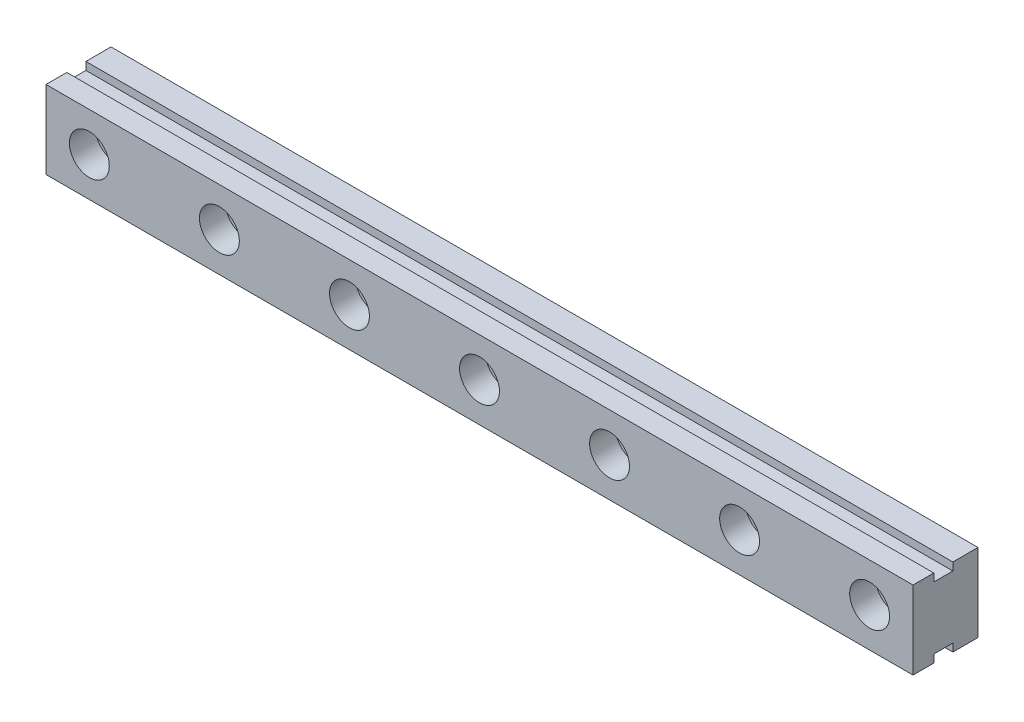
ISO-10303-21;
HEADER;
FILE_DESCRIPTION(('STEP AP214'),'2;1');
FILE_NAME('part.step','',(''),(''),'','','');
FILE_SCHEMA(('AUTOMOTIVE_DESIGN { 1 0 10303 214 1 1 1 1 }'));
ENDSEC;
DATA;
#1=APPLICATION_CONTEXT('core data for automotive mechanical design processes');
#2=APPLICATION_PROTOCOL_DEFINITION('international standard','automotive_design',2000,#1);
#3=PRODUCT_CONTEXT('',#1,'mechanical');
#4=PRODUCT('Part','Part','',(#3));
#5=PRODUCT_RELATED_PRODUCT_CATEGORY('part','',(#4));
#6=PRODUCT_DEFINITION_FORMATION('','',#4);
#7=PRODUCT_DEFINITION_CONTEXT('part definition',#1,'design');
#8=PRODUCT_DEFINITION('design','',#6,#7);
#9=PRODUCT_DEFINITION_SHAPE('','',#8);
#10=(LENGTH_UNIT() NAMED_UNIT(*) SI_UNIT(.MILLI.,.METRE.));
#11=(NAMED_UNIT(*) PLANE_ANGLE_UNIT() SI_UNIT($,.RADIAN.));
#12=(NAMED_UNIT(*) SI_UNIT($,.STERADIAN.) SOLID_ANGLE_UNIT());
#13=UNCERTAINTY_MEASURE_WITH_UNIT(LENGTH_MEASURE(1.E-05),#10,'distance_accuracy_value','');
#14=(GEOMETRIC_REPRESENTATION_CONTEXT(3) GLOBAL_UNCERTAINTY_ASSIGNED_CONTEXT((#13)) GLOBAL_UNIT_ASSIGNED_CONTEXT((#10,
#11,#12)) REPRESENTATION_CONTEXT('',''));
#15=CARTESIAN_POINT('',(0.,0.,0.));
#16=DIRECTION('',(0.,0.,1.));
#17=DIRECTION('',(1.,0.,0.));
#18=AXIS2_PLACEMENT_3D('',#15,#16,#17);
#19=CARTESIAN_POINT('',(78.,18.5,35.2));
#20=DIRECTION('',(0.,0.,-1.));
#21=DIRECTION('',(-1.,0.,0.));
#22=AXIS2_PLACEMENT_3D('',#19,#20,#21);
#23=CYLINDRICAL_SURFACE('',#22,1.35);
#24=CARTESIAN_POINT('',(78.,18.5,27.5));
#25=DIRECTION('',(0.,0.,1.));
#26=DIRECTION('',(1.,0.,0.));
#27=AXIS2_PLACEMENT_3D('',#24,#25,#26);
#28=CIRCLE('',#27,1.35);
#29=CARTESIAN_POINT('',(79.35,18.5,27.5));
#30=VERTEX_POINT('',#29);
#31=EDGE_CURVE('E241',#30,#30,#28,.F.);
#32=ORIENTED_EDGE('',*,*,#31,.T.);
#33=EDGE_LOOP('',(#32));
#34=FACE_BOUND('',#33,.T.);
#35=CARTESIAN_POINT('',(78.,18.5,32.));
#36=DIRECTION('',(0.,0.,1.));
#37=DIRECTION('',(1.,0.,0.));
#38=AXIS2_PLACEMENT_3D('',#35,#36,#37);
#39=CIRCLE('',#38,1.35);
#40=CARTESIAN_POINT('',(79.35,18.5,32.));
#41=VERTEX_POINT('',#40);
#42=EDGE_CURVE('E297',#41,#41,#39,.T.);
#43=ORIENTED_EDGE('',*,*,#42,.T.);
#44=EDGE_LOOP('',(#43));
#45=FACE_BOUND('',#44,.T.);
#46=ADVANCED_FACE('F44',(#34,#45),#23,.F.);
#47=CARTESIAN_POINT('',(63.,18.5,35.2));
#48=DIRECTION('',(0.,0.,-1.));
#49=DIRECTION('',(-1.,0.,0.));
#50=AXIS2_PLACEMENT_3D('',#47,#48,#49);
#51=CYLINDRICAL_SURFACE('',#50,1.35);
#52=CARTESIAN_POINT('',(63.,18.5,27.5));
#53=DIRECTION('',(0.,0.,1.));
#54=DIRECTION('',(1.,0.,0.));
#55=AXIS2_PLACEMENT_3D('',#52,#53,#54);
#56=CIRCLE('',#55,1.35);
#57=CARTESIAN_POINT('',(64.35,18.5,27.5));
#58=VERTEX_POINT('',#57);
#59=EDGE_CURVE('E249',#58,#58,#56,.F.);
#60=ORIENTED_EDGE('',*,*,#59,.T.);
#61=EDGE_LOOP('',(#60));
#62=FACE_BOUND('',#61,.T.);
#63=CARTESIAN_POINT('',(63.,18.5,32.));
#64=DIRECTION('',(0.,0.,1.));
#65=DIRECTION('',(1.,0.,0.));
#66=AXIS2_PLACEMENT_3D('',#63,#64,#65);
#67=CIRCLE('',#66,1.35);
#68=CARTESIAN_POINT('',(64.35,18.5,32.));
#69=VERTEX_POINT('',#68);
#70=EDGE_CURVE('E294',#69,#69,#67,.T.);
#71=ORIENTED_EDGE('',*,*,#70,.T.);
#72=EDGE_LOOP('',(#71));
#73=FACE_BOUND('',#72,.T.);
#74=ADVANCED_FACE('F434',(#62,#73),#51,.F.);
#75=CARTESIAN_POINT('',(48.,18.5,35.2));
#76=DIRECTION('',(0.,0.,-1.));
#77=DIRECTION('',(-1.,0.,0.));
#78=AXIS2_PLACEMENT_3D('',#75,#76,#77);
#79=CYLINDRICAL_SURFACE('',#78,1.35);
#80=CARTESIAN_POINT('',(48.,18.5,27.5));
#81=DIRECTION('',(0.,0.,1.));
#82=DIRECTION('',(1.,0.,0.));
#83=AXIS2_PLACEMENT_3D('',#80,#81,#82);
#84=CIRCLE('',#83,1.35);
#85=CARTESIAN_POINT('',(49.35,18.5,27.5));
#86=VERTEX_POINT('',#85);
#87=EDGE_CURVE('E251',#86,#86,#84,.F.);
#88=ORIENTED_EDGE('',*,*,#87,.T.);
#89=EDGE_LOOP('',(#88));
#90=FACE_BOUND('',#89,.T.);
#91=CARTESIAN_POINT('',(48.,18.5,32.));
#92=DIRECTION('',(0.,0.,1.));
#93=DIRECTION('',(1.,0.,0.));
#94=AXIS2_PLACEMENT_3D('',#91,#92,#93);
#95=CIRCLE('',#94,1.35);
#96=CARTESIAN_POINT('',(49.35,18.5,32.));
#97=VERTEX_POINT('',#96);
#98=EDGE_CURVE('E286',#97,#97,#95,.T.);
#99=ORIENTED_EDGE('',*,*,#98,.T.);
#100=EDGE_LOOP('',(#99));
#101=FACE_BOUND('',#100,.T.);
#102=ADVANCED_FACE('F442',(#90,#101),#79,.F.);
#103=CARTESIAN_POINT('',(33.,18.5,35.2));
#104=DIRECTION('',(0.,0.,-1.));
#105=DIRECTION('',(-1.,0.,0.));
#106=AXIS2_PLACEMENT_3D('',#103,#104,#105);
#107=CYLINDRICAL_SURFACE('',#106,1.35);
#108=CARTESIAN_POINT('',(33.,18.5,27.5));
#109=DIRECTION('',(0.,0.,1.));
#110=DIRECTION('',(1.,0.,0.));
#111=AXIS2_PLACEMENT_3D('',#108,#109,#110);
#112=CIRCLE('',#111,1.35);
#113=CARTESIAN_POINT('',(34.35,18.5,27.5));
#114=VERTEX_POINT('',#113);
#115=EDGE_CURVE('E260',#114,#114,#112,.F.);
#116=ORIENTED_EDGE('',*,*,#115,.T.);
#117=EDGE_LOOP('',(#116));
#118=FACE_BOUND('',#117,.T.);
#119=CARTESIAN_POINT('',(33.,18.5,32.));
#120=DIRECTION('',(0.,0.,1.));
#121=DIRECTION('',(1.,0.,0.));
#122=AXIS2_PLACEMENT_3D('',#119,#120,#121);
#123=CIRCLE('',#122,1.35);
#124=CARTESIAN_POINT('',(34.35,18.5,32.));
#125=VERTEX_POINT('',#124);
#126=EDGE_CURVE('E287',#125,#125,#123,.T.);
#127=ORIENTED_EDGE('',*,*,#126,.T.);
#128=EDGE_LOOP('',(#127));
#129=FACE_BOUND('',#128,.T.);
#130=ADVANCED_FACE('F509',(#118,#129),#107,.F.);
#131=CARTESIAN_POINT('',(18.,18.5,35.2));
#132=DIRECTION('',(0.,0.,-1.));
#133=DIRECTION('',(-1.,0.,0.));
#134=AXIS2_PLACEMENT_3D('',#131,#132,#133);
#135=CYLINDRICAL_SURFACE('',#134,1.35);
#136=CARTESIAN_POINT('',(18.,18.5,27.5));
#137=DIRECTION('',(0.,0.,1.));
#138=DIRECTION('',(1.,0.,0.));
#139=AXIS2_PLACEMENT_3D('',#136,#137,#138);
#140=CIRCLE('',#139,1.35);
#141=CARTESIAN_POINT('',(19.35,18.5,27.5));
#142=VERTEX_POINT('',#141);
#143=EDGE_CURVE('E261',#142,#142,#140,.F.);
#144=ORIENTED_EDGE('',*,*,#143,.T.);
#145=EDGE_LOOP('',(#144));
#146=FACE_BOUND('',#145,.T.);
#147=CARTESIAN_POINT('',(18.,18.5,32.));
#148=DIRECTION('',(0.,0.,1.));
#149=DIRECTION('',(1.,0.,0.));
#150=AXIS2_PLACEMENT_3D('',#147,#148,#149);
#151=CIRCLE('',#150,1.35);
#152=CARTESIAN_POINT('',(19.35,18.5,32.));
#153=VERTEX_POINT('',#152);
#154=EDGE_CURVE('E284',#153,#153,#151,.T.);
#155=ORIENTED_EDGE('',*,*,#154,.T.);
#156=EDGE_LOOP('',(#155));
#157=FACE_BOUND('',#156,.T.);
#158=ADVANCED_FACE('F498',(#146,#157),#135,.F.);
#159=CARTESIAN_POINT('',(3.,18.5,35.2));
#160=DIRECTION('',(0.,0.,-1.));
#161=DIRECTION('',(-1.,0.,0.));
#162=AXIS2_PLACEMENT_3D('',#159,#160,#161);
#163=CYLINDRICAL_SURFACE('',#162,1.35);
#164=CARTESIAN_POINT('',(3.,18.5,27.5));
#165=DIRECTION('',(0.,0.,1.));
#166=DIRECTION('',(1.,0.,0.));
#167=AXIS2_PLACEMENT_3D('',#164,#165,#166);
#168=CIRCLE('',#167,1.35);
#169=CARTESIAN_POINT('',(4.35,18.5,27.5));
#170=VERTEX_POINT('',#169);
#171=EDGE_CURVE('E264',#170,#170,#168,.F.);
#172=ORIENTED_EDGE('',*,*,#171,.T.);
#173=EDGE_LOOP('',(#172));
#174=FACE_BOUND('',#173,.T.);
#175=CARTESIAN_POINT('',(3.,18.5,32.));
#176=DIRECTION('',(0.,0.,1.));
#177=DIRECTION('',(1.,0.,0.));
#178=AXIS2_PLACEMENT_3D('',#175,#176,#177);
#179=CIRCLE('',#178,1.35);
#180=CARTESIAN_POINT('',(4.35,18.5,32.));
#181=VERTEX_POINT('',#180);
#182=EDGE_CURVE('E280',#181,#181,#179,.T.);
#183=ORIENTED_EDGE('',*,*,#182,.T.);
#184=EDGE_LOOP('',(#183));
#185=FACE_BOUND('',#184,.T.);
#186=ADVANCED_FACE('F491',(#174,#185),#163,.F.);
#187=CARTESIAN_POINT('',(-12.,18.5,35.2));
#188=DIRECTION('',(0.,0.,-1.));
#189=DIRECTION('',(-1.,0.,0.));
#190=AXIS2_PLACEMENT_3D('',#187,#188,#189);
#191=CYLINDRICAL_SURFACE('',#190,1.35);
#192=CARTESIAN_POINT('',(-12.,18.5,27.5));
#193=DIRECTION('',(0.,0.,1.));
#194=DIRECTION('',(1.,0.,0.));
#195=AXIS2_PLACEMENT_3D('',#192,#193,#194);
#196=CIRCLE('',#195,1.35);
#197=CARTESIAN_POINT('',(-10.65,18.5,27.5));
#198=VERTEX_POINT('',#197);
#199=EDGE_CURVE('E267',#198,#198,#196,.F.);
#200=ORIENTED_EDGE('',*,*,#199,.T.);
#201=EDGE_LOOP('',(#200));
#202=FACE_BOUND('',#201,.T.);
#203=CARTESIAN_POINT('',(-12.,18.5,32.));
#204=DIRECTION('',(0.,0.,1.));
#205=DIRECTION('',(1.,0.,0.));
#206=AXIS2_PLACEMENT_3D('',#203,#204,#205);
#207=CIRCLE('',#206,1.35);
#208=CARTESIAN_POINT('',(-10.65,18.5,32.));
#209=VERTEX_POINT('',#208);
#210=EDGE_CURVE('E272',#209,#209,#207,.T.);
#211=ORIENTED_EDGE('',*,*,#210,.T.);
#212=EDGE_LOOP('',(#211));
#213=FACE_BOUND('',#212,.T.);
#214=ADVANCED_FACE('F486',(#202,#213),#191,.F.);
#215=CARTESIAN_POINT('',(-17.,14.,35.));
#216=DIRECTION('',(0.,1.,0.));
#217=DIRECTION('',(0.,0.,1.));
#218=AXIS2_PLACEMENT_3D('',#215,#216,#217);
#219=PLANE('',#218);
#220=DIRECTION('',(1.,0.,0.));
#221=VECTOR('',#220,1.);
#222=CARTESIAN_POINT('',(-17.,14.,30.4));
#223=LINE('',#222,#221);
#224=CARTESIAN_POINT('',(-17.,14.,30.4));
#225=VERTEX_POINT('',#224);
#226=CARTESIAN_POINT('',(83.,14.,30.4));
#227=VERTEX_POINT('',#226);
#228=EDGE_CURVE('E62',#225,#227,#223,.T.);
#229=ORIENTED_EDGE('',*,*,#228,.F.);
#230=DIRECTION('',(0.,0.,-1.));
#231=VECTOR('',#230,1.);
#232=CARTESIAN_POINT('',(-17.,14.,35.));
#233=LINE('',#232,#231);
#234=CARTESIAN_POINT('',(-17.,14.,27.5));
#235=VERTEX_POINT('',#234);
#236=EDGE_CURVE('E229',#225,#235,#233,.T.);
#237=ORIENTED_EDGE('',*,*,#236,.T.);
#238=DIRECTION('',(1.,0.,0.));
#239=VECTOR('',#238,1.);
#240=CARTESIAN_POINT('',(-17.,14.,27.5));
#241=LINE('',#240,#239);
#242=CARTESIAN_POINT('',(83.,14.,27.5));
#243=VERTEX_POINT('',#242);
#244=EDGE_CURVE('E201',#235,#243,#241,.T.);
#245=ORIENTED_EDGE('',*,*,#244,.T.);
#246=DIRECTION('',(0.,0.,-1.));
#247=VECTOR('',#246,1.);
#248=CARTESIAN_POINT('',(83.,14.,35.));
#249=LINE('',#248,#247);
#250=EDGE_CURVE('E225',#227,#243,#249,.T.);
#251=ORIENTED_EDGE('',*,*,#250,.F.);
#252=EDGE_LOOP('',(#229,#237,#245,#251));
#253=FACE_BOUND('',#252,.T.);
#254=ADVANCED_FACE('F408',(#253),#219,.F.);
#255=CARTESIAN_POINT('',(83.,23.,35.));
#256=DIRECTION('',(0.,-1.,0.));
#257=DIRECTION('',(0.,0.,-1.));
#258=AXIS2_PLACEMENT_3D('',#255,#256,#257);
#259=PLANE('',#258);
#260=DIRECTION('',(-1.,0.,0.));
#261=VECTOR('',#260,1.);
#262=CARTESIAN_POINT('',(83.,23.,30.4));
#263=LINE('',#262,#261);
#264=CARTESIAN_POINT('',(83.,23.,30.4));
#265=VERTEX_POINT('',#264);
#266=CARTESIAN_POINT('',(-17.,23.,30.4));
#267=VERTEX_POINT('',#266);
#268=EDGE_CURVE('E136',#265,#267,#263,.T.);
#269=ORIENTED_EDGE('',*,*,#268,.F.);
#270=DIRECTION('',(0.,0.,-1.));
#271=VECTOR('',#270,1.);
#272=CARTESIAN_POINT('',(83.,23.,35.));
#273=LINE('',#272,#271);
#274=CARTESIAN_POINT('',(83.,23.,27.5));
#275=VERTEX_POINT('',#274);
#276=EDGE_CURVE('E220',#265,#275,#273,.T.);
#277=ORIENTED_EDGE('',*,*,#276,.T.);
#278=DIRECTION('',(-1.,0.,0.));
#279=VECTOR('',#278,1.);
#280=CARTESIAN_POINT('',(83.,23.,27.5));
#281=LINE('',#280,#279);
#282=CARTESIAN_POINT('',(-17.,23.,27.5));
#283=VERTEX_POINT('',#282);
#284=EDGE_CURVE('E186',#275,#283,#281,.T.);
#285=ORIENTED_EDGE('',*,*,#284,.T.);
#286=DIRECTION('',(0.,0.,-1.));
#287=VECTOR('',#286,1.);
#288=CARTESIAN_POINT('',(-17.,23.,35.));
#289=LINE('',#288,#287);
#290=EDGE_CURVE('E200',#267,#283,#289,.T.);
#291=ORIENTED_EDGE('',*,*,#290,.F.);
#292=EDGE_LOOP('',(#269,#277,#285,#291));
#293=FACE_BOUND('',#292,.T.);
#294=ADVANCED_FACE('F418',(#293),#259,.F.);
#295=CARTESIAN_POINT('',(-17.,23.,35.));
#296=DIRECTION('',(1.,0.,0.));
#297=DIRECTION('',(0.,0.,-1.));
#298=AXIS2_PLACEMENT_3D('',#295,#296,#297);
#299=PLANE('',#298);
#300=DIRECTION('',(0.,0.,-1.));
#301=VECTOR('',#300,1.);
#302=CARTESIAN_POINT('',(-17.,14.9,35.));
#303=LINE('',#302,#301);
#304=CARTESIAN_POINT('',(-17.,14.9,32.6));
#305=VERTEX_POINT('',#304);
#306=CARTESIAN_POINT('',(-17.,14.9,30.4));
#307=VERTEX_POINT('',#306);
#308=EDGE_CURVE('E182',#305,#307,#303,.T.);
#309=ORIENTED_EDGE('',*,*,#308,.F.);
#310=DIRECTION('',(0.,-1.,0.));
#311=VECTOR('',#310,1.);
#312=CARTESIAN_POINT('',(-17.,23.,32.6));
#313=LINE('',#312,#311);
#314=CARTESIAN_POINT('',(-17.,14.,32.6));
#315=VERTEX_POINT('',#314);
#316=EDGE_CURVE('E180',#305,#315,#313,.T.);
#317=ORIENTED_EDGE('',*,*,#316,.T.);
#318=CARTESIAN_POINT('',(-17.,14.,35.));
#319=VERTEX_POINT('',#318);
#320=EDGE_CURVE('E227',#319,#315,#233,.T.);
#321=ORIENTED_EDGE('',*,*,#320,.F.);
#322=DIRECTION('',(0.,-1.,0.));
#323=VECTOR('',#322,1.);
#324=CARTESIAN_POINT('',(-17.,23.,35.));
#325=LINE('',#324,#323);
#326=CARTESIAN_POINT('',(-17.,23.,35.));
#327=VERTEX_POINT('',#326);
#328=EDGE_CURVE('E183',#327,#319,#325,.T.);
#329=ORIENTED_EDGE('',*,*,#328,.F.);
#330=CARTESIAN_POINT('',(-17.,23.,32.6));
#331=VERTEX_POINT('',#330);
#332=EDGE_CURVE('E212',#327,#331,#289,.T.);
#333=ORIENTED_EDGE('',*,*,#332,.T.);
#334=DIRECTION('',(0.,-1.,0.));
#335=VECTOR('',#334,1.);
#336=CARTESIAN_POINT('',(-17.,23.,32.6));
#337=LINE('',#336,#335);
#338=CARTESIAN_POINT('',(-17.,22.1,32.6));
#339=VERTEX_POINT('',#338);
#340=EDGE_CURVE('E161',#331,#339,#337,.T.);
#341=ORIENTED_EDGE('',*,*,#340,.T.);
#342=DIRECTION('',(0.,0.,1.));
#343=VECTOR('',#342,1.);
#344=CARTESIAN_POINT('',(-17.,22.1,35.));
#345=LINE('',#344,#343);
#346=CARTESIAN_POINT('',(-17.,22.1,30.4));
#347=VERTEX_POINT('',#346);
#348=EDGE_CURVE('E147',#347,#339,#345,.T.);
#349=ORIENTED_EDGE('',*,*,#348,.F.);
#350=DIRECTION('',(0.,-1.,0.));
#351=VECTOR('',#350,1.);
#352=CARTESIAN_POINT('',(-17.,23.,30.4));
#353=LINE('',#352,#351);
#354=EDGE_CURVE('E137',#267,#347,#353,.T.);
#355=ORIENTED_EDGE('',*,*,#354,.F.);
#356=ORIENTED_EDGE('',*,*,#290,.T.);
#357=DIRECTION('',(0.,-1.,0.));
#358=VECTOR('',#357,1.);
#359=CARTESIAN_POINT('',(-17.,23.,27.5));
#360=LINE('',#359,#358);
#361=EDGE_CURVE('E184',#283,#235,#360,.T.);
#362=ORIENTED_EDGE('',*,*,#361,.T.);
#363=ORIENTED_EDGE('',*,*,#236,.F.);
#364=DIRECTION('',(0.,-1.,0.));
#365=VECTOR('',#364,1.);
#366=CARTESIAN_POINT('',(-17.,23.,30.4));
#367=LINE('',#366,#365);
#368=EDGE_CURVE('E167',#307,#225,#367,.T.);
#369=ORIENTED_EDGE('',*,*,#368,.F.);
#370=EDGE_LOOP('',(#309,#317,#321,#329,#333,#341,#349,#355,#356,#362,#363,#369));
#371=FACE_BOUND('',#370,.T.);
#372=ADVANCED_FACE('F50',(#371),#299,.F.);
#373=ORIENTED_EDGE('',*,*,#320,.T.);
#374=DIRECTION('',(1.,0.,0.));
#375=VECTOR('',#374,1.);
#376=CARTESIAN_POINT('',(-17.,14.,32.6));
#377=LINE('',#376,#375);
#378=CARTESIAN_POINT('',(83.,14.,32.6));
#379=VERTEX_POINT('',#378);
#380=EDGE_CURVE('E172',#315,#379,#377,.T.);
#381=ORIENTED_EDGE('',*,*,#380,.T.);
#382=CARTESIAN_POINT('',(83.,14.,35.));
#383=VERTEX_POINT('',#382);
#384=EDGE_CURVE('E224',#383,#379,#249,.T.);
#385=ORIENTED_EDGE('',*,*,#384,.F.);
#386=DIRECTION('',(1.,0.,0.));
#387=VECTOR('',#386,1.);
#388=CARTESIAN_POINT('',(-17.,14.,35.));
#389=LINE('',#388,#387);
#390=EDGE_CURVE('E190',#319,#383,#389,.T.);
#391=ORIENTED_EDGE('',*,*,#390,.F.);
#392=EDGE_LOOP('',(#373,#381,#385,#391));
#393=FACE_BOUND('',#392,.T.);
#394=ADVANCED_FACE('F391',(#393),#219,.F.);
#395=CARTESIAN_POINT('',(83.,14.,35.));
#396=DIRECTION('',(-1.,0.,0.));
#397=DIRECTION('',(0.,0.,1.));
#398=AXIS2_PLACEMENT_3D('',#395,#396,#397);
#399=PLANE('',#398);
#400=ORIENTED_EDGE('',*,*,#384,.T.);
#401=DIRECTION('',(0.,1.,0.));
#402=VECTOR('',#401,1.);
#403=CARTESIAN_POINT('',(83.,14.,32.6));
#404=LINE('',#403,#402);
#405=CARTESIAN_POINT('',(83.,14.9,32.6));
#406=VERTEX_POINT('',#405);
#407=EDGE_CURVE('E11',#379,#406,#404,.T.);
#408=ORIENTED_EDGE('',*,*,#407,.T.);
#409=DIRECTION('',(0.,0.,1.));
#410=VECTOR('',#409,1.);
#411=CARTESIAN_POINT('',(83.,14.9,35.));
#412=LINE('',#411,#410);
#413=CARTESIAN_POINT('',(83.,14.9,30.4));
#414=VERTEX_POINT('',#413);
#415=EDGE_CURVE('E54',#414,#406,#412,.T.);
#416=ORIENTED_EDGE('',*,*,#415,.F.);
#417=DIRECTION('',(0.,1.,0.));
#418=VECTOR('',#417,1.);
#419=CARTESIAN_POINT('',(83.,14.,30.4));
#420=LINE('',#419,#418);
#421=EDGE_CURVE('E238',#227,#414,#420,.T.);
#422=ORIENTED_EDGE('',*,*,#421,.F.);
#423=ORIENTED_EDGE('',*,*,#250,.T.);
#424=DIRECTION('',(0.,1.,0.));
#425=VECTOR('',#424,1.);
#426=CARTESIAN_POINT('',(83.,14.,27.5));
#427=LINE('',#426,#425);
#428=EDGE_CURVE('E210',#243,#275,#427,.T.);
#429=ORIENTED_EDGE('',*,*,#428,.T.);
#430=ORIENTED_EDGE('',*,*,#276,.F.);
#431=DIRECTION('',(0.,1.,0.));
#432=VECTOR('',#431,1.);
#433=CARTESIAN_POINT('',(83.,14.,30.4));
#434=LINE('',#433,#432);
#435=CARTESIAN_POINT('',(83.,22.1,30.4));
#436=VERTEX_POINT('',#435);
#437=EDGE_CURVE('E72',#436,#265,#434,.T.);
#438=ORIENTED_EDGE('',*,*,#437,.F.);
#439=DIRECTION('',(0.,0.,-1.));
#440=VECTOR('',#439,1.);
#441=CARTESIAN_POINT('',(83.,22.1,35.));
#442=LINE('',#441,#440);
#443=CARTESIAN_POINT('',(83.,22.1,32.6));
#444=VERTEX_POINT('',#443);
#445=EDGE_CURVE('E153',#444,#436,#442,.T.);
#446=ORIENTED_EDGE('',*,*,#445,.F.);
#447=DIRECTION('',(0.,1.,0.));
#448=VECTOR('',#447,1.);
#449=CARTESIAN_POINT('',(83.,14.,32.6));
#450=LINE('',#449,#448);
#451=CARTESIAN_POINT('',(83.,23.,32.6));
#452=VERTEX_POINT('',#451);
#453=EDGE_CURVE('E144',#444,#452,#450,.T.);
#454=ORIENTED_EDGE('',*,*,#453,.T.);
#455=CARTESIAN_POINT('',(83.,23.,35.));
#456=VERTEX_POINT('',#455);
#457=EDGE_CURVE('E217',#456,#452,#273,.T.);
#458=ORIENTED_EDGE('',*,*,#457,.F.);
#459=DIRECTION('',(0.,1.,0.));
#460=VECTOR('',#459,1.);
#461=CARTESIAN_POINT('',(83.,14.,35.));
#462=LINE('',#461,#460);
#463=EDGE_CURVE('E193',#383,#456,#462,.T.);
#464=ORIENTED_EDGE('',*,*,#463,.F.);
#465=EDGE_LOOP('',(#400,#408,#416,#422,#423,#429,#430,#438,#446,#454,#458,#464));
#466=FACE_BOUND('',#465,.T.);
#467=ADVANCED_FACE('F385',(#466),#399,.F.);
#468=ORIENTED_EDGE('',*,*,#457,.T.);
#469=DIRECTION('',(-1.,0.,0.));
#470=VECTOR('',#469,1.);
#471=CARTESIAN_POINT('',(83.,23.,32.6));
#472=LINE('',#471,#470);
#473=EDGE_CURVE('E234',#452,#331,#472,.T.);
#474=ORIENTED_EDGE('',*,*,#473,.T.);
#475=ORIENTED_EDGE('',*,*,#332,.F.);
#476=DIRECTION('',(-1.,0.,0.));
#477=VECTOR('',#476,1.);
#478=CARTESIAN_POINT('',(83.,23.,35.));
#479=LINE('',#478,#477);
#480=EDGE_CURVE('E198',#456,#327,#479,.T.);
#481=ORIENTED_EDGE('',*,*,#480,.F.);
#482=EDGE_LOOP('',(#468,#474,#475,#481));
#483=FACE_BOUND('',#482,.T.);
#484=ADVANCED_FACE('F390',(#483),#259,.F.);
#485=CARTESIAN_POINT('',(0.,0.,35.));
#486=DIRECTION('',(0.,0.,1.));
#487=DIRECTION('',(1.,0.,0.));
#488=AXIS2_PLACEMENT_3D('',#485,#486,#487);
#489=PLANE('',#488);
#490=CARTESIAN_POINT('',(-12.,18.5,35.));
#491=DIRECTION('',(0.,0.,1.));
#492=DIRECTION('',(1.,0.,0.));
#493=AXIS2_PLACEMENT_3D('',#490,#491,#492);
#494=CIRCLE('',#493,2.3);
#495=CARTESIAN_POINT('',(-9.7,18.5,35.));
#496=VERTEX_POINT('',#495);
#497=EDGE_CURVE('E47',#496,#496,#494,.F.);
#498=ORIENTED_EDGE('',*,*,#497,.T.);
#499=EDGE_LOOP('',(#498));
#500=FACE_BOUND('',#499,.T.);
#501=CARTESIAN_POINT('',(3.,18.5,35.));
#502=DIRECTION('',(0.,0.,1.));
#503=DIRECTION('',(1.,0.,0.));
#504=AXIS2_PLACEMENT_3D('',#501,#502,#503);
#505=CIRCLE('',#504,2.3);
#506=CARTESIAN_POINT('',(5.3,18.5,35.));
#507=VERTEX_POINT('',#506);
#508=EDGE_CURVE('E321',#507,#507,#505,.F.);
#509=ORIENTED_EDGE('',*,*,#508,.T.);
#510=EDGE_LOOP('',(#509));
#511=FACE_BOUND('',#510,.T.);
#512=CARTESIAN_POINT('',(18.,18.5,35.));
#513=DIRECTION('',(0.,0.,1.));
#514=DIRECTION('',(1.,0.,0.));
#515=AXIS2_PLACEMENT_3D('',#512,#513,#514);
#516=CIRCLE('',#515,2.3);
#517=CARTESIAN_POINT('',(20.3,18.5,35.));
#518=VERTEX_POINT('',#517);
#519=EDGE_CURVE('E318',#518,#518,#516,.F.);
#520=ORIENTED_EDGE('',*,*,#519,.T.);
#521=EDGE_LOOP('',(#520));
#522=FACE_BOUND('',#521,.T.);
#523=CARTESIAN_POINT('',(33.,18.5,35.));
#524=DIRECTION('',(0.,0.,1.));
#525=DIRECTION('',(1.,0.,0.));
#526=AXIS2_PLACEMENT_3D('',#523,#524,#525);
#527=CIRCLE('',#526,2.3);
#528=CARTESIAN_POINT('',(35.3,18.5,35.));
#529=VERTEX_POINT('',#528);
#530=EDGE_CURVE('E314',#529,#529,#527,.F.);
#531=ORIENTED_EDGE('',*,*,#530,.T.);
#532=EDGE_LOOP('',(#531));
#533=FACE_BOUND('',#532,.T.);
#534=CARTESIAN_POINT('',(48.,18.5,35.));
#535=DIRECTION('',(0.,0.,1.));
#536=DIRECTION('',(1.,0.,0.));
#537=AXIS2_PLACEMENT_3D('',#534,#535,#536);
#538=CIRCLE('',#537,2.3);
#539=CARTESIAN_POINT('',(50.3,18.5,35.));
#540=VERTEX_POINT('',#539);
#541=EDGE_CURVE('E309',#540,#540,#538,.F.);
#542=ORIENTED_EDGE('',*,*,#541,.T.);
#543=EDGE_LOOP('',(#542));
#544=FACE_BOUND('',#543,.T.);
#545=CARTESIAN_POINT('',(63.,18.5,35.));
#546=DIRECTION('',(0.,0.,1.));
#547=DIRECTION('',(1.,0.,0.));
#548=AXIS2_PLACEMENT_3D('',#545,#546,#547);
#549=CIRCLE('',#548,2.3);
#550=CARTESIAN_POINT('',(65.3,18.5,35.));
#551=VERTEX_POINT('',#550);
#552=EDGE_CURVE('E308',#551,#551,#549,.F.);
#553=ORIENTED_EDGE('',*,*,#552,.T.);
#554=EDGE_LOOP('',(#553));
#555=FACE_BOUND('',#554,.T.);
#556=CARTESIAN_POINT('',(78.,18.5,35.));
#557=DIRECTION('',(0.,0.,1.));
#558=DIRECTION('',(1.,0.,0.));
#559=AXIS2_PLACEMENT_3D('',#556,#557,#558);
#560=CIRCLE('',#559,2.3);
#561=CARTESIAN_POINT('',(80.3,18.5,35.));
#562=VERTEX_POINT('',#561);
#563=EDGE_CURVE('E305',#562,#562,#560,.F.);
#564=ORIENTED_EDGE('',*,*,#563,.T.);
#565=EDGE_LOOP('',(#564));
#566=FACE_BOUND('',#565,.T.);
#567=ORIENTED_EDGE('',*,*,#328,.T.);
#568=ORIENTED_EDGE('',*,*,#390,.T.);
#569=ORIENTED_EDGE('',*,*,#463,.T.);
#570=ORIENTED_EDGE('',*,*,#480,.T.);
#571=EDGE_LOOP('',(#567,#568,#569,#570));
#572=FACE_BOUND('',#571,.T.);
#573=ADVANCED_FACE('F329',(#500,#511,#522,#533,#544,#555,#566,#572),#489,.T.);
#574=CARTESIAN_POINT('',(0.,0.,27.5));
#575=DIRECTION('',(0.,0.,1.));
#576=DIRECTION('',(1.,0.,0.));
#577=AXIS2_PLACEMENT_3D('',#574,#575,#576);
#578=PLANE('',#577);
#579=ORIENTED_EDGE('',*,*,#199,.F.);
#580=EDGE_LOOP('',(#579));
#581=FACE_BOUND('',#580,.T.);
#582=ORIENTED_EDGE('',*,*,#171,.F.);
#583=EDGE_LOOP('',(#582));
#584=FACE_BOUND('',#583,.T.);
#585=ORIENTED_EDGE('',*,*,#143,.F.);
#586=EDGE_LOOP('',(#585));
#587=FACE_BOUND('',#586,.T.);
#588=ORIENTED_EDGE('',*,*,#115,.F.);
#589=EDGE_LOOP('',(#588));
#590=FACE_BOUND('',#589,.T.);
#591=ORIENTED_EDGE('',*,*,#87,.F.);
#592=EDGE_LOOP('',(#591));
#593=FACE_BOUND('',#592,.T.);
#594=ORIENTED_EDGE('',*,*,#59,.F.);
#595=EDGE_LOOP('',(#594));
#596=FACE_BOUND('',#595,.T.);
#597=ORIENTED_EDGE('',*,*,#31,.F.);
#598=EDGE_LOOP('',(#597));
#599=FACE_BOUND('',#598,.T.);
#600=ORIENTED_EDGE('',*,*,#361,.F.);
#601=ORIENTED_EDGE('',*,*,#284,.F.);
#602=ORIENTED_EDGE('',*,*,#428,.F.);
#603=ORIENTED_EDGE('',*,*,#244,.F.);
#604=EDGE_LOOP('',(#600,#601,#602,#603));
#605=FACE_BOUND('',#604,.T.);
#606=ADVANCED_FACE('F420',(#581,#584,#587,#590,#593,#596,#599,#605),#578,.F.);
#607=CARTESIAN_POINT('',(-17.1,22.1,32.6));
#608=DIRECTION('',(0.,1.,0.));
#609=DIRECTION('',(0.,0.,1.));
#610=AXIS2_PLACEMENT_3D('',#607,#608,#609);
#611=PLANE('',#610);
#612=ORIENTED_EDGE('',*,*,#348,.T.);
#613=DIRECTION('',(1.,0.,0.));
#614=VECTOR('',#613,1.);
#615=CARTESIAN_POINT('',(-17.1,22.1,32.6));
#616=LINE('',#615,#614);
#617=EDGE_CURVE('E156',#339,#444,#616,.T.);
#618=ORIENTED_EDGE('',*,*,#617,.T.);
#619=ORIENTED_EDGE('',*,*,#445,.T.);
#620=DIRECTION('',(1.,0.,0.));
#621=VECTOR('',#620,1.);
#622=CARTESIAN_POINT('',(-17.1,22.1,30.4));
#623=LINE('',#622,#621);
#624=EDGE_CURVE('E139',#347,#436,#623,.T.);
#625=ORIENTED_EDGE('',*,*,#624,.F.);
#626=EDGE_LOOP('',(#612,#618,#619,#625));
#627=FACE_BOUND('',#626,.T.);
#628=ADVANCED_FACE('F146',(#627),#611,.T.);
#629=CARTESIAN_POINT('',(0.,0.,32.6));
#630=DIRECTION('',(0.,0.,1.));
#631=DIRECTION('',(1.,0.,0.));
#632=AXIS2_PLACEMENT_3D('',#629,#630,#631);
#633=PLANE('',#632);
#634=ORIENTED_EDGE('',*,*,#473,.F.);
#635=ORIENTED_EDGE('',*,*,#453,.F.);
#636=ORIENTED_EDGE('',*,*,#617,.F.);
#637=ORIENTED_EDGE('',*,*,#340,.F.);
#638=EDGE_LOOP('',(#634,#635,#636,#637));
#639=FACE_BOUND('',#638,.T.);
#640=ADVANCED_FACE('F428',(#639),#633,.F.);
#641=CARTESIAN_POINT('',(0.,0.,30.4));
#642=DIRECTION('',(0.,0.,1.));
#643=DIRECTION('',(1.,0.,0.));
#644=AXIS2_PLACEMENT_3D('',#641,#642,#643);
#645=PLANE('',#644);
#646=ORIENTED_EDGE('',*,*,#354,.T.);
#647=ORIENTED_EDGE('',*,*,#624,.T.);
#648=ORIENTED_EDGE('',*,*,#437,.T.);
#649=ORIENTED_EDGE('',*,*,#268,.T.);
#650=EDGE_LOOP('',(#646,#647,#648,#649));
#651=FACE_BOUND('',#650,.T.);
#652=ADVANCED_FACE('F138',(#651),#645,.T.);
#653=CARTESIAN_POINT('',(83.1,14.9,32.6));
#654=DIRECTION('',(0.,-1.,0.));
#655=DIRECTION('',(0.,0.,-1.));
#656=AXIS2_PLACEMENT_3D('',#653,#654,#655);
#657=PLANE('',#656);
#658=ORIENTED_EDGE('',*,*,#308,.T.);
#659=DIRECTION('',(-1.,0.,0.));
#660=VECTOR('',#659,1.);
#661=CARTESIAN_POINT('',(83.1,14.9,30.4));
#662=LINE('',#661,#660);
#663=EDGE_CURVE('E154',#414,#307,#662,.T.);
#664=ORIENTED_EDGE('',*,*,#663,.F.);
#665=ORIENTED_EDGE('',*,*,#415,.T.);
#666=DIRECTION('',(-1.,0.,0.));
#667=VECTOR('',#666,1.);
#668=CARTESIAN_POINT('',(83.1,14.9,32.6));
#669=LINE('',#668,#667);
#670=EDGE_CURVE('E366',#406,#305,#669,.T.);
#671=ORIENTED_EDGE('',*,*,#670,.T.);
#672=EDGE_LOOP('',(#658,#664,#665,#671));
#673=FACE_BOUND('',#672,.T.);
#674=ADVANCED_FACE('F401',(#673),#657,.T.);
#675=CARTESIAN_POINT('',(0.,0.,32.6));
#676=DIRECTION('',(0.,0.,1.));
#677=DIRECTION('',(1.,0.,0.));
#678=AXIS2_PLACEMENT_3D('',#675,#676,#677);
#679=PLANE('',#678);
#680=ORIENTED_EDGE('',*,*,#670,.F.);
#681=ORIENTED_EDGE('',*,*,#407,.F.);
#682=ORIENTED_EDGE('',*,*,#380,.F.);
#683=ORIENTED_EDGE('',*,*,#316,.F.);
#684=EDGE_LOOP('',(#680,#681,#682,#683));
#685=FACE_BOUND('',#684,.T.);
#686=ADVANCED_FACE('F398',(#685),#679,.F.);
#687=CARTESIAN_POINT('',(0.,0.,30.4));
#688=DIRECTION('',(0.,0.,1.));
#689=DIRECTION('',(1.,0.,0.));
#690=AXIS2_PLACEMENT_3D('',#687,#688,#689);
#691=PLANE('',#690);
#692=ORIENTED_EDGE('',*,*,#368,.T.);
#693=ORIENTED_EDGE('',*,*,#228,.T.);
#694=ORIENTED_EDGE('',*,*,#421,.T.);
#695=ORIENTED_EDGE('',*,*,#663,.T.);
#696=EDGE_LOOP('',(#692,#693,#694,#695));
#697=FACE_BOUND('',#696,.T.);
#698=ADVANCED_FACE('F338',(#697),#691,.T.);
#699=CARTESIAN_POINT('',(-12.,18.5,35.2));
#700=DIRECTION('',(0.,0.,-1.));
#701=DIRECTION('',(-1.,0.,0.));
#702=AXIS2_PLACEMENT_3D('',#699,#700,#701);
#703=CYLINDRICAL_SURFACE('',#702,2.3);
#704=ORIENTED_EDGE('',*,*,#497,.F.);
#705=EDGE_LOOP('',(#704));
#706=FACE_BOUND('',#705,.T.);
#707=CARTESIAN_POINT('',(-12.,18.5,32.));
#708=DIRECTION('',(0.,0.,1.));
#709=DIRECTION('',(1.,0.,0.));
#710=AXIS2_PLACEMENT_3D('',#707,#708,#709);
#711=CIRCLE('',#710,2.3);
#712=CARTESIAN_POINT('',(-9.7,18.5,32.));
#713=VERTEX_POINT('',#712);
#714=EDGE_CURVE('E279',#713,#713,#711,.T.);
#715=ORIENTED_EDGE('',*,*,#714,.F.);
#716=EDGE_LOOP('',(#715));
#717=FACE_BOUND('',#716,.T.);
#718=ADVANCED_FACE('F335',(#706,#717),#703,.F.);
#719=CARTESIAN_POINT('',(-12.,18.5,32.));
#720=DIRECTION('',(0.,0.,1.));
#721=DIRECTION('',(1.,0.,0.));
#722=AXIS2_PLACEMENT_3D('',#719,#720,#721);
#723=PLANE('',#722);
#724=ORIENTED_EDGE('',*,*,#210,.F.);
#725=EDGE_LOOP('',(#724));
#726=FACE_BOUND('',#725,.T.);
#727=ORIENTED_EDGE('',*,*,#714,.T.);
#728=EDGE_LOOP('',(#727));
#729=FACE_BOUND('',#728,.T.);
#730=ADVANCED_FACE('F333',(#726,#729),#723,.T.);
#731=CARTESIAN_POINT('',(3.,18.5,35.2));
#732=DIRECTION('',(0.,0.,-1.));
#733=DIRECTION('',(-1.,0.,0.));
#734=AXIS2_PLACEMENT_3D('',#731,#732,#733);
#735=CYLINDRICAL_SURFACE('',#734,2.3);
#736=ORIENTED_EDGE('',*,*,#508,.F.);
#737=EDGE_LOOP('',(#736));
#738=FACE_BOUND('',#737,.T.);
#739=CARTESIAN_POINT('',(3.,18.5,32.));
#740=DIRECTION('',(0.,0.,1.));
#741=DIRECTION('',(1.,0.,0.));
#742=AXIS2_PLACEMENT_3D('',#739,#740,#741);
#743=CIRCLE('',#742,2.3);
#744=CARTESIAN_POINT('',(5.3,18.5,32.));
#745=VERTEX_POINT('',#744);
#746=EDGE_CURVE('E345',#745,#745,#743,.T.);
#747=ORIENTED_EDGE('',*,*,#746,.F.);
#748=EDGE_LOOP('',(#747));
#749=FACE_BOUND('',#748,.T.);
#750=ADVANCED_FACE('F547',(#738,#749),#735,.F.);
#751=CARTESIAN_POINT('',(3.,18.5,32.));
#752=DIRECTION('',(0.,0.,1.));
#753=DIRECTION('',(1.,0.,0.));
#754=AXIS2_PLACEMENT_3D('',#751,#752,#753);
#755=PLANE('',#754);
#756=ORIENTED_EDGE('',*,*,#182,.F.);
#757=EDGE_LOOP('',(#756));
#758=FACE_BOUND('',#757,.T.);
#759=ORIENTED_EDGE('',*,*,#746,.T.);
#760=EDGE_LOOP('',(#759));
#761=FACE_BOUND('',#760,.T.);
#762=ADVANCED_FACE('F557',(#758,#761),#755,.T.);
#763=CARTESIAN_POINT('',(18.,18.5,35.2));
#764=DIRECTION('',(0.,0.,-1.));
#765=DIRECTION('',(-1.,0.,0.));
#766=AXIS2_PLACEMENT_3D('',#763,#764,#765);
#767=CYLINDRICAL_SURFACE('',#766,2.3);
#768=ORIENTED_EDGE('',*,*,#519,.F.);
#769=EDGE_LOOP('',(#768));
#770=FACE_BOUND('',#769,.T.);
#771=CARTESIAN_POINT('',(18.,18.5,32.));
#772=DIRECTION('',(0.,0.,1.));
#773=DIRECTION('',(1.,0.,0.));
#774=AXIS2_PLACEMENT_3D('',#771,#772,#773);
#775=CIRCLE('',#774,2.3);
#776=CARTESIAN_POINT('',(20.3,18.5,32.));
#777=VERTEX_POINT('',#776);
#778=EDGE_CURVE('E347',#777,#777,#775,.T.);
#779=ORIENTED_EDGE('',*,*,#778,.F.);
#780=EDGE_LOOP('',(#779));
#781=FACE_BOUND('',#780,.T.);
#782=ADVANCED_FACE('F566',(#770,#781),#767,.F.);
#783=CARTESIAN_POINT('',(18.,18.5,32.));
#784=DIRECTION('',(0.,0.,1.));
#785=DIRECTION('',(1.,0.,0.));
#786=AXIS2_PLACEMENT_3D('',#783,#784,#785);
#787=PLANE('',#786);
#788=ORIENTED_EDGE('',*,*,#154,.F.);
#789=EDGE_LOOP('',(#788));
#790=FACE_BOUND('',#789,.T.);
#791=ORIENTED_EDGE('',*,*,#778,.T.);
#792=EDGE_LOOP('',(#791));
#793=FACE_BOUND('',#792,.T.);
#794=ADVANCED_FACE('F578',(#790,#793),#787,.T.);
#795=CARTESIAN_POINT('',(33.,18.5,35.2));
#796=DIRECTION('',(0.,0.,-1.));
#797=DIRECTION('',(-1.,0.,0.));
#798=AXIS2_PLACEMENT_3D('',#795,#796,#797);
#799=CYLINDRICAL_SURFACE('',#798,2.3);
#800=ORIENTED_EDGE('',*,*,#530,.F.);
#801=EDGE_LOOP('',(#800));
#802=FACE_BOUND('',#801,.T.);
#803=CARTESIAN_POINT('',(33.,18.5,32.));
#804=DIRECTION('',(0.,0.,1.));
#805=DIRECTION('',(1.,0.,0.));
#806=AXIS2_PLACEMENT_3D('',#803,#804,#805);
#807=CIRCLE('',#806,2.3);
#808=CARTESIAN_POINT('',(35.3,18.5,32.));
#809=VERTEX_POINT('',#808);
#810=EDGE_CURVE('E354',#809,#809,#807,.T.);
#811=ORIENTED_EDGE('',*,*,#810,.F.);
#812=EDGE_LOOP('',(#811));
#813=FACE_BOUND('',#812,.T.);
#814=ADVANCED_FACE('F586',(#802,#813),#799,.F.);
#815=CARTESIAN_POINT('',(33.,18.5,32.));
#816=DIRECTION('',(0.,0.,1.));
#817=DIRECTION('',(1.,0.,0.));
#818=AXIS2_PLACEMENT_3D('',#815,#816,#817);
#819=PLANE('',#818);
#820=ORIENTED_EDGE('',*,*,#126,.F.);
#821=EDGE_LOOP('',(#820));
#822=FACE_BOUND('',#821,.T.);
#823=ORIENTED_EDGE('',*,*,#810,.T.);
#824=EDGE_LOOP('',(#823));
#825=FACE_BOUND('',#824,.T.);
#826=ADVANCED_FACE('F598',(#822,#825),#819,.T.);
#827=CARTESIAN_POINT('',(48.,18.5,35.2));
#828=DIRECTION('',(0.,0.,-1.));
#829=DIRECTION('',(-1.,0.,0.));
#830=AXIS2_PLACEMENT_3D('',#827,#828,#829);
#831=CYLINDRICAL_SURFACE('',#830,2.3);
#832=ORIENTED_EDGE('',*,*,#541,.F.);
#833=EDGE_LOOP('',(#832));
#834=FACE_BOUND('',#833,.T.);
#835=CARTESIAN_POINT('',(48.,18.5,32.));
#836=DIRECTION('',(0.,0.,1.));
#837=DIRECTION('',(1.,0.,0.));
#838=AXIS2_PLACEMENT_3D('',#835,#836,#837);
#839=CIRCLE('',#838,2.3);
#840=CARTESIAN_POINT('',(50.3,18.5,32.));
#841=VERTEX_POINT('',#840);
#842=EDGE_CURVE('E357',#841,#841,#839,.T.);
#843=ORIENTED_EDGE('',*,*,#842,.F.);
#844=EDGE_LOOP('',(#843));
#845=FACE_BOUND('',#844,.T.);
#846=ADVANCED_FACE('F609',(#834,#845),#831,.F.);
#847=CARTESIAN_POINT('',(48.,18.5,32.));
#848=DIRECTION('',(0.,0.,1.));
#849=DIRECTION('',(1.,0.,0.));
#850=AXIS2_PLACEMENT_3D('',#847,#848,#849);
#851=PLANE('',#850);
#852=ORIENTED_EDGE('',*,*,#98,.F.);
#853=EDGE_LOOP('',(#852));
#854=FACE_BOUND('',#853,.T.);
#855=ORIENTED_EDGE('',*,*,#842,.T.);
#856=EDGE_LOOP('',(#855));
#857=FACE_BOUND('',#856,.T.);
#858=ADVANCED_FACE('F618',(#854,#857),#851,.T.);
#859=CARTESIAN_POINT('',(63.,18.5,35.2));
#860=DIRECTION('',(0.,0.,-1.));
#861=DIRECTION('',(-1.,0.,0.));
#862=AXIS2_PLACEMENT_3D('',#859,#860,#861);
#863=CYLINDRICAL_SURFACE('',#862,2.3);
#864=ORIENTED_EDGE('',*,*,#552,.F.);
#865=EDGE_LOOP('',(#864));
#866=FACE_BOUND('',#865,.T.);
#867=CARTESIAN_POINT('',(63.,18.5,32.));
#868=DIRECTION('',(0.,0.,1.));
#869=DIRECTION('',(1.,0.,0.));
#870=AXIS2_PLACEMENT_3D('',#867,#868,#869);
#871=CIRCLE('',#870,2.3);
#872=CARTESIAN_POINT('',(65.3,18.5,32.));
#873=VERTEX_POINT('',#872);
#874=EDGE_CURVE('E356',#873,#873,#871,.T.);
#875=ORIENTED_EDGE('',*,*,#874,.F.);
#876=EDGE_LOOP('',(#875));
#877=FACE_BOUND('',#876,.T.);
#878=ADVANCED_FACE('F627',(#866,#877),#863,.F.);
#879=CARTESIAN_POINT('',(63.,18.5,32.));
#880=DIRECTION('',(0.,0.,1.));
#881=DIRECTION('',(1.,0.,0.));
#882=AXIS2_PLACEMENT_3D('',#879,#880,#881);
#883=PLANE('',#882);
#884=ORIENTED_EDGE('',*,*,#70,.F.);
#885=EDGE_LOOP('',(#884));
#886=FACE_BOUND('',#885,.T.);
#887=ORIENTED_EDGE('',*,*,#874,.T.);
#888=EDGE_LOOP('',(#887));
#889=FACE_BOUND('',#888,.T.);
#890=ADVANCED_FACE('F636',(#886,#889),#883,.T.);
#891=CARTESIAN_POINT('',(78.,18.5,35.2));
#892=DIRECTION('',(0.,0.,-1.));
#893=DIRECTION('',(-1.,0.,0.));
#894=AXIS2_PLACEMENT_3D('',#891,#892,#893);
#895=CYLINDRICAL_SURFACE('',#894,2.3);
#896=ORIENTED_EDGE('',*,*,#563,.F.);
#897=EDGE_LOOP('',(#896));
#898=FACE_BOUND('',#897,.T.);
#899=CARTESIAN_POINT('',(78.,18.5,32.));
#900=DIRECTION('',(0.,0.,1.));
#901=DIRECTION('',(1.,0.,0.));
#902=AXIS2_PLACEMENT_3D('',#899,#900,#901);
#903=CIRCLE('',#902,2.3);
#904=CARTESIAN_POINT('',(80.3,18.5,32.));
#905=VERTEX_POINT('',#904);
#906=EDGE_CURVE('E365',#905,#905,#903,.T.);
#907=ORIENTED_EDGE('',*,*,#906,.F.);
#908=EDGE_LOOP('',(#907));
#909=FACE_BOUND('',#908,.T.);
#910=ADVANCED_FACE('F648',(#898,#909),#895,.F.);
#911=CARTESIAN_POINT('',(78.,18.5,32.));
#912=DIRECTION('',(0.,0.,1.));
#913=DIRECTION('',(1.,0.,0.));
#914=AXIS2_PLACEMENT_3D('',#911,#912,#913);
#915=PLANE('',#914);
#916=ORIENTED_EDGE('',*,*,#42,.F.);
#917=EDGE_LOOP('',(#916));
#918=FACE_BOUND('',#917,.T.);
#919=ORIENTED_EDGE('',*,*,#906,.T.);
#920=EDGE_LOOP('',(#919));
#921=FACE_BOUND('',#920,.T.);
#922=ADVANCED_FACE('F657',(#918,#921),#915,.T.);
#923=CLOSED_SHELL('',(#46,#74,#102,#130,#158,#186,#214,#254,#294,#372,#394,#467,#484,#573,#606,
#628,#640,#652,#674,#686,#698,#718,#730,#750,#762,#782,#794,#814,#826,#846,#858,#878,#890,#910,#922));
#924=MANIFOLD_SOLID_BREP('B2',#923);
#925=ADVANCED_BREP_SHAPE_REPRESENTATION('',(#18,#924),#14);
#926=SHAPE_DEFINITION_REPRESENTATION(#9,#925);
ENDSEC;
END-ISO-10303-21;
